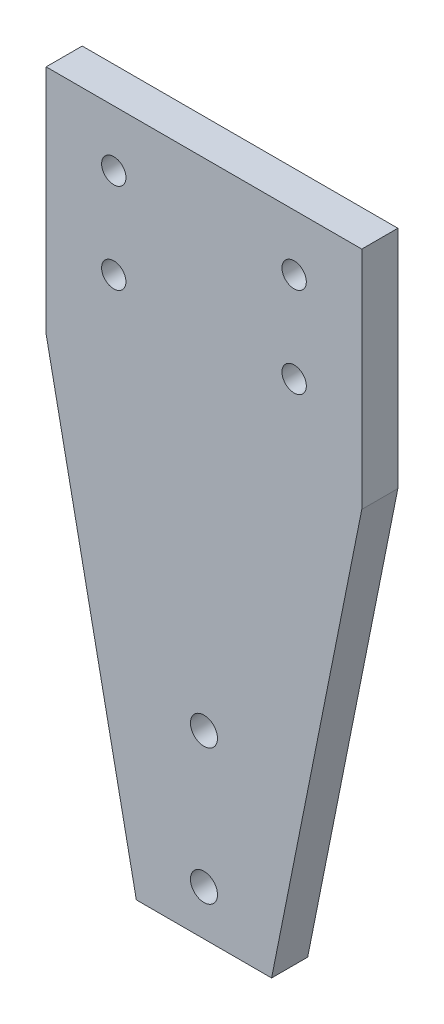
ISO-10303-21;
HEADER;
FILE_DESCRIPTION(('STEP AP214'),'2;1');
FILE_NAME('part.step','',(''),(''),'','','');
FILE_SCHEMA(('AUTOMOTIVE_DESIGN { 1 0 10303 214 1 1 1 1 }'));
ENDSEC;
DATA;
#1=APPLICATION_CONTEXT('core data for automotive mechanical design processes');
#2=APPLICATION_PROTOCOL_DEFINITION('international standard','automotive_design',2000,#1);
#3=PRODUCT_CONTEXT('',#1,'mechanical');
#4=PRODUCT('Part','Part','',(#3));
#5=PRODUCT_RELATED_PRODUCT_CATEGORY('part','',(#4));
#6=PRODUCT_DEFINITION_FORMATION('','',#4);
#7=PRODUCT_DEFINITION_CONTEXT('part definition',#1,'design');
#8=PRODUCT_DEFINITION('design','',#6,#7);
#9=PRODUCT_DEFINITION_SHAPE('','',#8);
#10=(LENGTH_UNIT() NAMED_UNIT(*) SI_UNIT(.MILLI.,.METRE.));
#11=(NAMED_UNIT(*) PLANE_ANGLE_UNIT() SI_UNIT($,.RADIAN.));
#12=(NAMED_UNIT(*) SI_UNIT($,.STERADIAN.) SOLID_ANGLE_UNIT());
#13=UNCERTAINTY_MEASURE_WITH_UNIT(LENGTH_MEASURE(1.E-05),#10,'distance_accuracy_value','');
#14=(GEOMETRIC_REPRESENTATION_CONTEXT(3) GLOBAL_UNCERTAINTY_ASSIGNED_CONTEXT((#13)) GLOBAL_UNIT_ASSIGNED_CONTEXT((#10,
#11,#12)) REPRESENTATION_CONTEXT('',''));
#15=CARTESIAN_POINT('',(0.,0.,0.));
#16=DIRECTION('',(0.,0.,1.));
#17=DIRECTION('',(1.,0.,0.));
#18=AXIS2_PLACEMENT_3D('',#15,#16,#17);
#19=CARTESIAN_POINT('',(0.,0.,10.16));
#20=DIRECTION('',(0.,0.,1.));
#21=DIRECTION('',(1.,0.,0.));
#22=AXIS2_PLACEMENT_3D('',#19,#20,#21);
#23=PLANE('',#22);
#24=CARTESIAN_POINT('',(19.05,50.8,10.16));
#25=DIRECTION('',(0.,0.,1.));
#26=DIRECTION('',(1.,0.,0.));
#27=AXIS2_PLACEMENT_3D('',#24,#25,#26);
#28=CIRCLE('',#27,3.81);
#29=CARTESIAN_POINT('',(22.86,50.8,10.16));
#30=VERTEX_POINT('',#29);
#31=EDGE_CURVE('E349',#30,#30,#28,.T.);
#32=ORIENTED_EDGE('',*,*,#31,.F.);
#33=EDGE_LOOP('',(#32));
#34=FACE_BOUND('',#33,.T.);
#35=CARTESIAN_POINT('',(44.45,149.287730395854,10.16));
#36=DIRECTION('',(0.,0.,-1.));
#37=DIRECTION('',(-1.,0.,0.));
#38=AXIS2_PLACEMENT_3D('',#35,#36,#37);
#39=CIRCLE('',#38,3.42899999999998);
#40=CARTESIAN_POINT('',(41.021,149.287730395854,10.16));
#41=VERTEX_POINT('',#40);
#42=EDGE_CURVE('E357',#41,#41,#39,.T.);
#43=ORIENTED_EDGE('',*,*,#42,.T.);
#44=EDGE_LOOP('',(#43));
#45=FACE_BOUND('',#44,.T.);
#46=CARTESIAN_POINT('',(44.45,174.687730395854,10.16));
#47=DIRECTION('',(0.,0.,-1.));
#48=DIRECTION('',(-1.,0.,0.));
#49=AXIS2_PLACEMENT_3D('',#46,#47,#48);
#50=CIRCLE('',#49,3.42899999999998);
#51=CARTESIAN_POINT('',(41.021,174.687730395854,10.16));
#52=VERTEX_POINT('',#51);
#53=EDGE_CURVE('E365',#52,#52,#50,.T.);
#54=ORIENTED_EDGE('',*,*,#53,.T.);
#55=EDGE_LOOP('',(#54));
#56=FACE_BOUND('',#55,.T.);
#57=CARTESIAN_POINT('',(-6.35,174.687730395854,10.16));
#58=DIRECTION('',(0.,0.,1.));
#59=DIRECTION('',(1.,0.,0.));
#60=AXIS2_PLACEMENT_3D('',#57,#58,#59);
#61=CIRCLE('',#60,3.42899999999999);
#62=CARTESIAN_POINT('',(-2.92100000000001,174.687730395854,10.16));
#63=VERTEX_POINT('',#62);
#64=EDGE_CURVE('E262',#63,#63,#61,.T.);
#65=ORIENTED_EDGE('',*,*,#64,.F.);
#66=EDGE_LOOP('',(#65));
#67=FACE_BOUND('',#66,.T.);
#68=DIRECTION('',(0.,-1.,0.));
#69=VECTOR('',#68,1.);
#70=CARTESIAN_POINT('',(-25.4,190.5,10.16));
#71=LINE('',#70,#69);
#72=CARTESIAN_POINT('',(-25.4,190.5,10.16));
#73=VERTEX_POINT('',#72);
#74=CARTESIAN_POINT('',(-25.4,125.291623319093,10.16));
#75=VERTEX_POINT('',#74);
#76=EDGE_CURVE('E274',#73,#75,#71,.T.);
#77=ORIENTED_EDGE('',*,*,#76,.T.);
#78=DIRECTION('',(0.198685338977704,-0.98006333268586,0.));
#79=VECTOR('',#78,1.);
#80=CARTESIAN_POINT('',(-25.4,125.291623319093,10.16));
#81=LINE('',#80,#79);
#82=CARTESIAN_POINT('',(0.,0.,10.16));
#83=VERTEX_POINT('',#82);
#84=EDGE_CURVE('E222',#75,#83,#81,.T.);
#85=ORIENTED_EDGE('',*,*,#84,.T.);
#86=DIRECTION('',(1.,0.,0.));
#87=VECTOR('',#86,1.);
#88=CARTESIAN_POINT('',(0.,0.,10.16));
#89=LINE('',#88,#87);
#90=CARTESIAN_POINT('',(38.1,0.,10.16));
#91=VERTEX_POINT('',#90);
#92=EDGE_CURVE('E235',#83,#91,#89,.T.);
#93=ORIENTED_EDGE('',*,*,#92,.T.);
#94=DIRECTION('',(0.196116135138184,0.98058067569092,0.));
#95=VECTOR('',#94,1.);
#96=CARTESIAN_POINT('',(38.1,0.,10.16));
#97=LINE('',#96,#95);
#98=CARTESIAN_POINT('',(63.5,127.,10.16));
#99=VERTEX_POINT('',#98);
#100=EDGE_CURVE('E229',#91,#99,#97,.T.);
#101=ORIENTED_EDGE('',*,*,#100,.T.);
#102=DIRECTION('',(0.,1.,0.));
#103=VECTOR('',#102,1.);
#104=CARTESIAN_POINT('',(63.5,127.,10.16));
#105=LINE('',#104,#103);
#106=CARTESIAN_POINT('',(63.5,190.5,10.16));
#107=VERTEX_POINT('',#106);
#108=EDGE_CURVE('E233',#99,#107,#105,.T.);
#109=ORIENTED_EDGE('',*,*,#108,.T.);
#110=DIRECTION('',(-1.,0.,0.));
#111=VECTOR('',#110,1.);
#112=CARTESIAN_POINT('',(63.5,190.5,10.16));
#113=LINE('',#112,#111);
#114=EDGE_CURVE('E185',#107,#73,#113,.T.);
#115=ORIENTED_EDGE('',*,*,#114,.T.);
#116=EDGE_LOOP('',(#77,#85,#93,#101,#109,#115));
#117=FACE_BOUND('',#116,.T.);
#118=CARTESIAN_POINT('',(-6.35,149.287730395854,10.16));
#119=DIRECTION('',(0.,0.,1.));
#120=DIRECTION('',(1.,0.,0.));
#121=AXIS2_PLACEMENT_3D('',#118,#119,#120);
#122=CIRCLE('',#121,3.42899999999999);
#123=CARTESIAN_POINT('',(-2.92100000000001,149.287730395854,10.16));
#124=VERTEX_POINT('',#123);
#125=EDGE_CURVE('E373',#124,#124,#122,.T.);
#126=ORIENTED_EDGE('',*,*,#125,.F.);
#127=EDGE_LOOP('',(#126));
#128=FACE_BOUND('',#127,.T.);
#129=CARTESIAN_POINT('',(19.05,12.7,10.16));
#130=DIRECTION('',(0.,0.,1.));
#131=DIRECTION('',(1.,0.,0.));
#132=AXIS2_PLACEMENT_3D('',#129,#130,#131);
#133=CIRCLE('',#132,3.81);
#134=CARTESIAN_POINT('',(22.86,12.7,10.16));
#135=VERTEX_POINT('',#134);
#136=EDGE_CURVE('E338',#135,#135,#133,.T.);
#137=ORIENTED_EDGE('',*,*,#136,.F.);
#138=EDGE_LOOP('',(#137));
#139=FACE_BOUND('',#138,.T.);
#140=ADVANCED_FACE('F167',(#34,#45,#56,#67,#117,#128,#139),#23,.T.);
#141=CARTESIAN_POINT('',(0.,0.,0.));
#142=DIRECTION('',(0.,0.,1.));
#143=DIRECTION('',(1.,0.,0.));
#144=AXIS2_PLACEMENT_3D('',#141,#142,#143);
#145=PLANE('',#144);
#146=CARTESIAN_POINT('',(44.45,149.287730395854,0.));
#147=DIRECTION('',(0.,0.,-1.));
#148=DIRECTION('',(-1.,0.,0.));
#149=AXIS2_PLACEMENT_3D('',#146,#147,#148);
#150=CIRCLE('',#149,3.42899999999998);
#151=CARTESIAN_POINT('',(41.021,149.287730395854,0.));
#152=VERTEX_POINT('',#151);
#153=EDGE_CURVE('E353',#152,#152,#150,.T.);
#154=ORIENTED_EDGE('',*,*,#153,.F.);
#155=EDGE_LOOP('',(#154));
#156=FACE_BOUND('',#155,.T.);
#157=CARTESIAN_POINT('',(44.45,174.687730395854,0.));
#158=DIRECTION('',(0.,0.,-1.));
#159=DIRECTION('',(-1.,0.,0.));
#160=AXIS2_PLACEMENT_3D('',#157,#158,#159);
#161=CIRCLE('',#160,3.42899999999998);
#162=CARTESIAN_POINT('',(41.021,174.687730395854,0.));
#163=VERTEX_POINT('',#162);
#164=EDGE_CURVE('E361',#163,#163,#161,.T.);
#165=ORIENTED_EDGE('',*,*,#164,.F.);
#166=EDGE_LOOP('',(#165));
#167=FACE_BOUND('',#166,.T.);
#168=DIRECTION('',(0.,-1.,0.));
#169=VECTOR('',#168,1.);
#170=CARTESIAN_POINT('',(-25.4,190.5,0.));
#171=LINE('',#170,#169);
#172=CARTESIAN_POINT('',(-25.4,190.5,0.));
#173=VERTEX_POINT('',#172);
#174=CARTESIAN_POINT('',(-25.4,125.291623319093,0.));
#175=VERTEX_POINT('',#174);
#176=EDGE_CURVE('E257',#173,#175,#171,.T.);
#177=ORIENTED_EDGE('',*,*,#176,.F.);
#178=DIRECTION('',(-1.,0.,0.));
#179=VECTOR('',#178,1.);
#180=CARTESIAN_POINT('',(63.5,190.5,0.));
#181=LINE('',#180,#179);
#182=CARTESIAN_POINT('',(63.5,190.5,0.));
#183=VERTEX_POINT('',#182);
#184=EDGE_CURVE('E214',#183,#173,#181,.T.);
#185=ORIENTED_EDGE('',*,*,#184,.F.);
#186=DIRECTION('',(0.,1.,0.));
#187=VECTOR('',#186,1.);
#188=CARTESIAN_POINT('',(63.5,127.,0.));
#189=LINE('',#188,#187);
#190=CARTESIAN_POINT('',(63.5,127.,0.));
#191=VERTEX_POINT('',#190);
#192=EDGE_CURVE('E208',#191,#183,#189,.T.);
#193=ORIENTED_EDGE('',*,*,#192,.F.);
#194=DIRECTION('',(0.196116135138184,0.98058067569092,0.));
#195=VECTOR('',#194,1.);
#196=CARTESIAN_POINT('',(38.1,0.,0.));
#197=LINE('',#196,#195);
#198=CARTESIAN_POINT('',(38.1,0.,0.));
#199=VERTEX_POINT('',#198);
#200=EDGE_CURVE('E244',#199,#191,#197,.T.);
#201=ORIENTED_EDGE('',*,*,#200,.F.);
#202=DIRECTION('',(1.,0.,0.));
#203=VECTOR('',#202,1.);
#204=CARTESIAN_POINT('',(0.,0.,0.));
#205=LINE('',#204,#203);
#206=CARTESIAN_POINT('',(0.,0.,0.));
#207=VERTEX_POINT('',#206);
#208=EDGE_CURVE('E265',#207,#199,#205,.T.);
#209=ORIENTED_EDGE('',*,*,#208,.F.);
#210=DIRECTION('',(0.198685338977704,-0.98006333268586,0.));
#211=VECTOR('',#210,1.);
#212=CARTESIAN_POINT('',(-25.4,125.291623319093,0.));
#213=LINE('',#212,#211);
#214=EDGE_CURVE('E261',#175,#207,#213,.T.);
#215=ORIENTED_EDGE('',*,*,#214,.F.);
#216=EDGE_LOOP('',(#177,#185,#193,#201,#209,#215));
#217=FACE_BOUND('',#216,.T.);
#218=CARTESIAN_POINT('',(-6.35,174.687730395854,0.));
#219=DIRECTION('',(0.,0.,1.));
#220=DIRECTION('',(1.,0.,0.));
#221=AXIS2_PLACEMENT_3D('',#218,#219,#220);
#222=CIRCLE('',#221,3.42899999999999);
#223=CARTESIAN_POINT('',(-2.92100000000001,174.687730395854,0.));
#224=VERTEX_POINT('',#223);
#225=EDGE_CURVE('E377',#224,#224,#222,.T.);
#226=ORIENTED_EDGE('',*,*,#225,.T.);
#227=EDGE_LOOP('',(#226));
#228=FACE_BOUND('',#227,.T.);
#229=CARTESIAN_POINT('',(-6.35,149.287730395854,0.));
#230=DIRECTION('',(0.,0.,1.));
#231=DIRECTION('',(1.,0.,0.));
#232=AXIS2_PLACEMENT_3D('',#229,#230,#231);
#233=CIRCLE('',#232,3.42899999999999);
#234=CARTESIAN_POINT('',(-2.92100000000001,149.287730395854,0.));
#235=VERTEX_POINT('',#234);
#236=EDGE_CURVE('E369',#235,#235,#233,.T.);
#237=ORIENTED_EDGE('',*,*,#236,.T.);
#238=EDGE_LOOP('',(#237));
#239=FACE_BOUND('',#238,.T.);
#240=CARTESIAN_POINT('',(19.05,50.8,0.));
#241=DIRECTION('',(0.,0.,1.));
#242=DIRECTION('',(1.,0.,0.));
#243=AXIS2_PLACEMENT_3D('',#240,#241,#242);
#244=CIRCLE('',#243,3.81);
#245=CARTESIAN_POINT('',(22.86,50.8,0.));
#246=VERTEX_POINT('',#245);
#247=EDGE_CURVE('E346',#246,#246,#244,.T.);
#248=ORIENTED_EDGE('',*,*,#247,.T.);
#249=EDGE_LOOP('',(#248));
#250=FACE_BOUND('',#249,.T.);
#251=CARTESIAN_POINT('',(19.05,12.7,0.));
#252=DIRECTION('',(0.,0.,1.));
#253=DIRECTION('',(1.,0.,0.));
#254=AXIS2_PLACEMENT_3D('',#251,#252,#253);
#255=CIRCLE('',#254,3.81);
#256=CARTESIAN_POINT('',(22.86,12.7,0.));
#257=VERTEX_POINT('',#256);
#258=EDGE_CURVE('E341',#257,#257,#255,.T.);
#259=ORIENTED_EDGE('',*,*,#258,.T.);
#260=EDGE_LOOP('',(#259));
#261=FACE_BOUND('',#260,.T.);
#262=ADVANCED_FACE('F287',(#156,#167,#217,#228,#239,#250,#261),#145,.F.);
#263=CARTESIAN_POINT('',(-25.4,190.5,10.16));
#264=DIRECTION('',(1.,0.,0.));
#265=DIRECTION('',(0.,1.,0.));
#266=AXIS2_PLACEMENT_3D('',#263,#264,#265);
#267=PLANE('',#266);
#268=ORIENTED_EDGE('',*,*,#176,.T.);
#269=DIRECTION('',(0.,0.,-1.));
#270=VECTOR('',#269,1.);
#271=CARTESIAN_POINT('',(-25.4,125.291623319093,10.16));
#272=LINE('',#271,#270);
#273=EDGE_CURVE('E12',#75,#175,#272,.T.);
#274=ORIENTED_EDGE('',*,*,#273,.F.);
#275=ORIENTED_EDGE('',*,*,#76,.F.);
#276=DIRECTION('',(0.,0.,-1.));
#277=VECTOR('',#276,1.);
#278=CARTESIAN_POINT('',(-25.4,190.5,10.16));
#279=LINE('',#278,#277);
#280=EDGE_CURVE('E253',#73,#173,#279,.T.);
#281=ORIENTED_EDGE('',*,*,#280,.T.);
#282=EDGE_LOOP('',(#268,#274,#275,#281));
#283=FACE_BOUND('',#282,.T.);
#284=ADVANCED_FACE('F169',(#283),#267,.F.);
#285=CARTESIAN_POINT('',(-25.4,125.291623319093,10.16));
#286=DIRECTION('',(0.98006333268586,0.198685338977704,0.));
#287=DIRECTION('',(-0.198685338977704,0.98006333268586,0.));
#288=AXIS2_PLACEMENT_3D('',#285,#286,#287);
#289=PLANE('',#288);
#290=ORIENTED_EDGE('',*,*,#214,.T.);
#291=DIRECTION('',(0.,0.,-1.));
#292=VECTOR('',#291,1.);
#293=CARTESIAN_POINT('',(0.,0.,10.16));
#294=LINE('',#293,#292);
#295=EDGE_CURVE('E177',#83,#207,#294,.T.);
#296=ORIENTED_EDGE('',*,*,#295,.F.);
#297=ORIENTED_EDGE('',*,*,#84,.F.);
#298=ORIENTED_EDGE('',*,*,#273,.T.);
#299=EDGE_LOOP('',(#290,#296,#297,#298));
#300=FACE_BOUND('',#299,.T.);
#301=ADVANCED_FACE('F464',(#300),#289,.F.);
#302=CARTESIAN_POINT('',(0.,0.,10.16));
#303=DIRECTION('',(0.,1.,0.));
#304=DIRECTION('',(0.,0.,1.));
#305=AXIS2_PLACEMENT_3D('',#302,#303,#304);
#306=PLANE('',#305);
#307=ORIENTED_EDGE('',*,*,#208,.T.);
#308=DIRECTION('',(0.,0.,-1.));
#309=VECTOR('',#308,1.);
#310=CARTESIAN_POINT('',(38.1,0.,10.16));
#311=LINE('',#310,#309);
#312=EDGE_CURVE('E246',#91,#199,#311,.T.);
#313=ORIENTED_EDGE('',*,*,#312,.F.);
#314=ORIENTED_EDGE('',*,*,#92,.F.);
#315=ORIENTED_EDGE('',*,*,#295,.T.);
#316=EDGE_LOOP('',(#307,#313,#314,#315));
#317=FACE_BOUND('',#316,.T.);
#318=ADVANCED_FACE('F284',(#317),#306,.F.);
#319=CARTESIAN_POINT('',(38.1,0.,10.16));
#320=DIRECTION('',(-0.98058067569092,0.196116135138184,0.));
#321=DIRECTION('',(-0.196116135138184,-0.98058067569092,0.));
#322=AXIS2_PLACEMENT_3D('',#319,#320,#321);
#323=PLANE('',#322);
#324=ORIENTED_EDGE('',*,*,#200,.T.);
#325=DIRECTION('',(0.,0.,-1.));
#326=VECTOR('',#325,1.);
#327=CARTESIAN_POINT('',(63.5,127.,10.16));
#328=LINE('',#327,#326);
#329=EDGE_CURVE('E241',#99,#191,#328,.T.);
#330=ORIENTED_EDGE('',*,*,#329,.F.);
#331=ORIENTED_EDGE('',*,*,#100,.F.);
#332=ORIENTED_EDGE('',*,*,#312,.T.);
#333=EDGE_LOOP('',(#324,#330,#331,#332));
#334=FACE_BOUND('',#333,.T.);
#335=ADVANCED_FACE('F242',(#334),#323,.F.);
#336=CARTESIAN_POINT('',(63.5,127.,10.16));
#337=DIRECTION('',(-1.,0.,0.));
#338=DIRECTION('',(0.,0.,1.));
#339=AXIS2_PLACEMENT_3D('',#336,#337,#338);
#340=PLANE('',#339);
#341=ORIENTED_EDGE('',*,*,#192,.T.);
#342=DIRECTION('',(0.,0.,-1.));
#343=VECTOR('',#342,1.);
#344=CARTESIAN_POINT('',(63.5,190.5,10.16));
#345=LINE('',#344,#343);
#346=EDGE_CURVE('E247',#107,#183,#345,.T.);
#347=ORIENTED_EDGE('',*,*,#346,.F.);
#348=ORIENTED_EDGE('',*,*,#108,.F.);
#349=ORIENTED_EDGE('',*,*,#329,.T.);
#350=EDGE_LOOP('',(#341,#347,#348,#349));
#351=FACE_BOUND('',#350,.T.);
#352=ADVANCED_FACE('F249',(#351),#340,.F.);
#353=CARTESIAN_POINT('',(63.5,190.5,10.16));
#354=DIRECTION('',(0.,-1.,0.));
#355=DIRECTION('',(0.,0.,-1.));
#356=AXIS2_PLACEMENT_3D('',#353,#354,#355);
#357=PLANE('',#356);
#358=ORIENTED_EDGE('',*,*,#184,.T.);
#359=ORIENTED_EDGE('',*,*,#280,.F.);
#360=ORIENTED_EDGE('',*,*,#114,.F.);
#361=ORIENTED_EDGE('',*,*,#346,.T.);
#362=EDGE_LOOP('',(#358,#359,#360,#361));
#363=FACE_BOUND('',#362,.T.);
#364=ADVANCED_FACE('F292',(#363),#357,.F.);
#365=CARTESIAN_POINT('',(-6.35,174.687730395854,10.16));
#366=DIRECTION('',(0.,0.,-1.));
#367=DIRECTION('',(-1.,0.,0.));
#368=AXIS2_PLACEMENT_3D('',#365,#366,#367);
#369=CYLINDRICAL_SURFACE('',#368,3.42899999999999);
#370=ORIENTED_EDGE('',*,*,#64,.T.);
#371=EDGE_LOOP('',(#370));
#372=FACE_BOUND('',#371,.T.);
#373=ORIENTED_EDGE('',*,*,#225,.F.);
#374=EDGE_LOOP('',(#373));
#375=FACE_BOUND('',#374,.T.);
#376=ADVANCED_FACE('F294',(#372,#375),#369,.F.);
#377=CARTESIAN_POINT('',(-6.35,149.287730395854,10.16));
#378=DIRECTION('',(0.,0.,-1.));
#379=DIRECTION('',(-1.,0.,0.));
#380=AXIS2_PLACEMENT_3D('',#377,#378,#379);
#381=CYLINDRICAL_SURFACE('',#380,3.42899999999999);
#382=ORIENTED_EDGE('',*,*,#125,.T.);
#383=EDGE_LOOP('',(#382));
#384=FACE_BOUND('',#383,.T.);
#385=ORIENTED_EDGE('',*,*,#236,.F.);
#386=EDGE_LOOP('',(#385));
#387=FACE_BOUND('',#386,.T.);
#388=ADVANCED_FACE('F300',(#384,#387),#381,.F.);
#389=CARTESIAN_POINT('',(44.45,174.687730395854,10.16));
#390=DIRECTION('',(0.,0.,-1.));
#391=DIRECTION('',(-1.,0.,0.));
#392=AXIS2_PLACEMENT_3D('',#389,#390,#391);
#393=CYLINDRICAL_SURFACE('',#392,3.42899999999998);
#394=ORIENTED_EDGE('',*,*,#53,.F.);
#395=EDGE_LOOP('',(#394));
#396=FACE_BOUND('',#395,.T.);
#397=ORIENTED_EDGE('',*,*,#164,.T.);
#398=EDGE_LOOP('',(#397));
#399=FACE_BOUND('',#398,.T.);
#400=ADVANCED_FACE('F317',(#396,#399),#393,.F.);
#401=CARTESIAN_POINT('',(44.45,149.287730395854,10.16));
#402=DIRECTION('',(0.,0.,-1.));
#403=DIRECTION('',(-1.,0.,0.));
#404=AXIS2_PLACEMENT_3D('',#401,#402,#403);
#405=CYLINDRICAL_SURFACE('',#404,3.42899999999998);
#406=ORIENTED_EDGE('',*,*,#42,.F.);
#407=EDGE_LOOP('',(#406));
#408=FACE_BOUND('',#407,.T.);
#409=ORIENTED_EDGE('',*,*,#153,.T.);
#410=EDGE_LOOP('',(#409));
#411=FACE_BOUND('',#410,.T.);
#412=ADVANCED_FACE('F321',(#408,#411),#405,.F.);
#413=CARTESIAN_POINT('',(19.05,50.8,10.16));
#414=DIRECTION('',(0.,0.,-1.));
#415=DIRECTION('',(-1.,0.,0.));
#416=AXIS2_PLACEMENT_3D('',#413,#414,#415);
#417=CYLINDRICAL_SURFACE('',#416,3.81);
#418=ORIENTED_EDGE('',*,*,#31,.T.);
#419=EDGE_LOOP('',(#418));
#420=FACE_BOUND('',#419,.T.);
#421=ORIENTED_EDGE('',*,*,#247,.F.);
#422=EDGE_LOOP('',(#421));
#423=FACE_BOUND('',#422,.T.);
#424=ADVANCED_FACE('F325',(#420,#423),#417,.F.);
#425=CARTESIAN_POINT('',(19.05,12.7,10.16));
#426=DIRECTION('',(0.,0.,-1.));
#427=DIRECTION('',(-1.,0.,0.));
#428=AXIS2_PLACEMENT_3D('',#425,#426,#427);
#429=CYLINDRICAL_SURFACE('',#428,3.81);
#430=ORIENTED_EDGE('',*,*,#136,.T.);
#431=EDGE_LOOP('',(#430));
#432=FACE_BOUND('',#431,.T.);
#433=ORIENTED_EDGE('',*,*,#258,.F.);
#434=EDGE_LOOP('',(#433));
#435=FACE_BOUND('',#434,.T.);
#436=ADVANCED_FACE('F329',(#432,#435),#429,.F.);
#437=CLOSED_SHELL('',(#140,#262,#284,#301,#318,#335,#352,#364,#376,#388,#400,#412,#424,#436));
#438=MANIFOLD_SOLID_BREP('B2',#437);
#439=ADVANCED_BREP_SHAPE_REPRESENTATION('',(#18,#438),#14);
#440=SHAPE_DEFINITION_REPRESENTATION(#9,#439);
ENDSEC;
END-ISO-10303-21;
